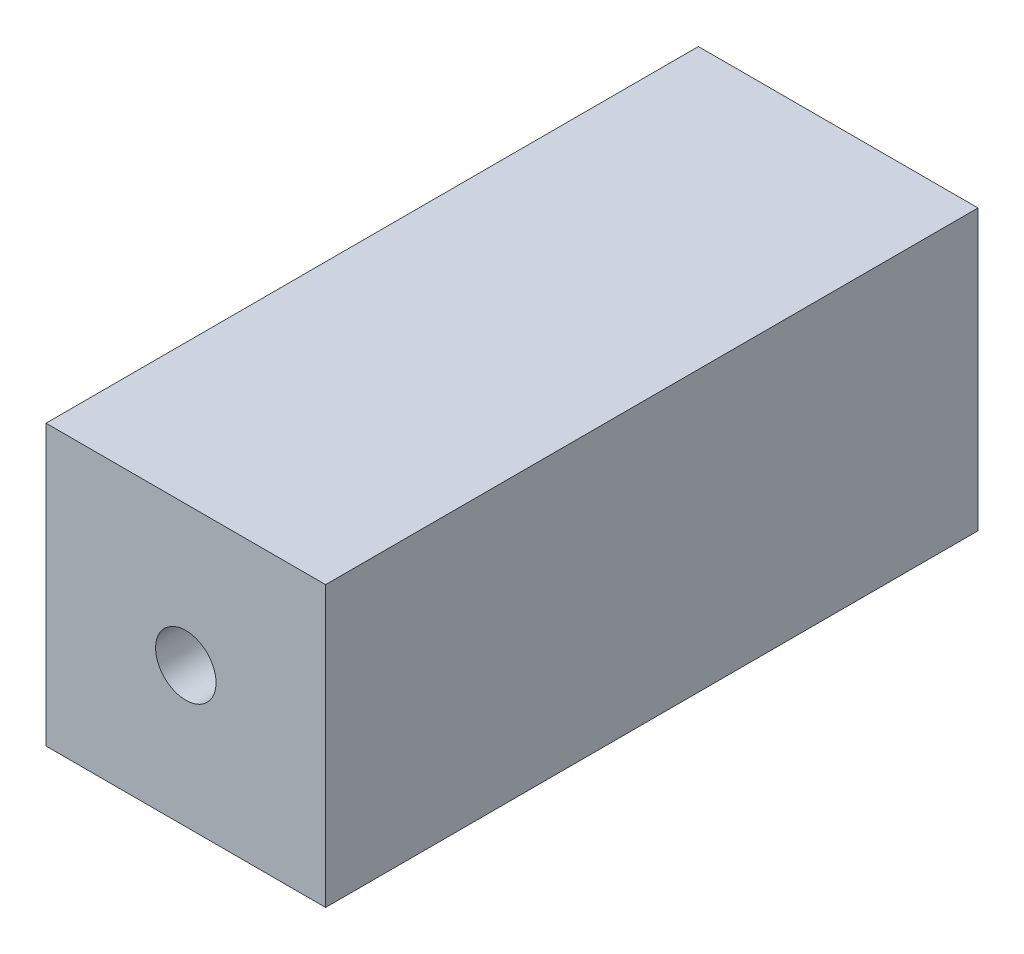
ISO-10303-21;
HEADER;
FILE_DESCRIPTION(('STEP AP214'),'2;1');
FILE_NAME('part.step','',(''),(''),'','','');
FILE_SCHEMA(('AUTOMOTIVE_DESIGN { 1 0 10303 214 1 1 1 1 }'));
ENDSEC;
DATA;
#1=APPLICATION_CONTEXT('core data for automotive mechanical design processes');
#2=APPLICATION_PROTOCOL_DEFINITION('international standard','automotive_design',2000,#1);
#3=PRODUCT_CONTEXT('',#1,'mechanical');
#4=PRODUCT('Part','Part','',(#3));
#5=PRODUCT_RELATED_PRODUCT_CATEGORY('part','',(#4));
#6=PRODUCT_DEFINITION_FORMATION('','',#4);
#7=PRODUCT_DEFINITION_CONTEXT('part definition',#1,'design');
#8=PRODUCT_DEFINITION('design','',#6,#7);
#9=PRODUCT_DEFINITION_SHAPE('','',#8);
#10=(LENGTH_UNIT() NAMED_UNIT(*) SI_UNIT(.MILLI.,.METRE.));
#11=(NAMED_UNIT(*) PLANE_ANGLE_UNIT() SI_UNIT($,.RADIAN.));
#12=(NAMED_UNIT(*) SI_UNIT($,.STERADIAN.) SOLID_ANGLE_UNIT());
#13=UNCERTAINTY_MEASURE_WITH_UNIT(LENGTH_MEASURE(1.E-05),#10,'distance_accuracy_value','');
#14=(GEOMETRIC_REPRESENTATION_CONTEXT(3) GLOBAL_UNCERTAINTY_ASSIGNED_CONTEXT((#13)) GLOBAL_UNIT_ASSIGNED_CONTEXT((#10,
#11,#12)) REPRESENTATION_CONTEXT('',''));
#15=CARTESIAN_POINT('',(0.,0.,0.));
#16=DIRECTION('',(0.,0.,1.));
#17=DIRECTION('',(1.,0.,0.));
#18=AXIS2_PLACEMENT_3D('',#15,#16,#17);
#19=CARTESIAN_POINT('',(7.5,9.99999999936563,20.));
#20=DIRECTION('',(0.,-1.,0.));
#21=DIRECTION('',(0.,0.,-1.));
#22=AXIS2_PLACEMENT_3D('',#19,#20,#21);
#23=CONICAL_SURFACE('',#22,1.22949999950379,1.02974425738303);
#24=CARTESIAN_POINT('',(7.49999999987949,10.7387581321632,20.));
#25=VERTEX_POINT('',#24);
#26=VERTEX_LOOP('',#25);
#27=FACE_BOUND('',#26,.T.);
#28=CARTESIAN_POINT('',(7.5,10.,20.));
#29=DIRECTION('',(0.,-1.,0.));
#30=DIRECTION('',(0.,0.,-1.));
#31=AXIS2_PLACEMENT_3D('',#28,#29,#30);
#32=CIRCLE('',#31,1.2295);
#33=CARTESIAN_POINT('',(7.5,10.,18.7705));
#34=VERTEX_POINT('',#33);
#35=EDGE_CURVE('E69',#34,#34,#32,.T.);
#36=ORIENTED_EDGE('',*,*,#35,.T.);
#37=EDGE_LOOP('',(#36));
#38=FACE_BOUND('',#37,.T.);
#39=ADVANCED_FACE('F17',(#27,#38),#23,.F.);
#40=CARTESIAN_POINT('',(7.5,9.99999999936563,5.));
#41=DIRECTION('',(0.,-1.,0.));
#42=DIRECTION('',(0.,0.,-1.));
#43=AXIS2_PLACEMENT_3D('',#40,#41,#42);
#44=CONICAL_SURFACE('',#43,1.22949999950379,1.02974425738303);
#45=CARTESIAN_POINT('',(7.49999999987949,10.7387581321632,5.));
#46=VERTEX_POINT('',#45);
#47=VERTEX_LOOP('',#46);
#48=FACE_BOUND('',#47,.T.);
#49=CARTESIAN_POINT('',(7.5,10.,5.));
#50=DIRECTION('',(0.,-1.,0.));
#51=DIRECTION('',(0.,0.,-1.));
#52=AXIS2_PLACEMENT_3D('',#49,#50,#51);
#53=CIRCLE('',#52,1.2295);
#54=CARTESIAN_POINT('',(7.5,10.,3.7705));
#55=VERTEX_POINT('',#54);
#56=EDGE_CURVE('E71',#55,#55,#53,.T.);
#57=ORIENTED_EDGE('',*,*,#56,.T.);
#58=EDGE_LOOP('',(#57));
#59=FACE_BOUND('',#58,.T.);
#60=ADVANCED_FACE('F66',(#48,#59),#44,.F.);
#61=CARTESIAN_POINT('',(7.5,7.5,25.0000000008299));
#62=DIRECTION('',(0.,0.,1.));
#63=DIRECTION('',(1.,0.,0.));
#64=AXIS2_PLACEMENT_3D('',#61,#62,#63);
#65=CONICAL_SURFACE('',#64,1.62099999931115,1.02974425743707);
#66=CARTESIAN_POINT('',(7.49999999993634,7.5,24.0260049351946));
#67=VERTEX_POINT('',#66);
#68=VERTEX_LOOP('',#67);
#69=FACE_BOUND('',#68,.T.);
#70=CARTESIAN_POINT('',(7.5,7.5,25.));
#71=DIRECTION('',(0.,0.,1.));
#72=DIRECTION('',(1.,0.,0.));
#73=AXIS2_PLACEMENT_3D('',#70,#71,#72);
#74=CIRCLE('',#73,1.621);
#75=CARTESIAN_POINT('',(9.121,7.5,25.));
#76=VERTEX_POINT('',#75);
#77=EDGE_CURVE('E74',#76,#76,#74,.T.);
#78=ORIENTED_EDGE('',*,*,#77,.T.);
#79=EDGE_LOOP('',(#78));
#80=FACE_BOUND('',#79,.T.);
#81=ADVANCED_FACE('F220',(#69,#80),#65,.F.);
#82=CARTESIAN_POINT('',(7.5,5.,20.));
#83=DIRECTION('',(0.,-1.,0.));
#84=DIRECTION('',(0.,0.,-1.));
#85=AXIS2_PLACEMENT_3D('',#82,#83,#84);
#86=CYLINDRICAL_SURFACE('',#85,1.2295);
#87=ORIENTED_EDGE('',*,*,#35,.F.);
#88=EDGE_LOOP('',(#87));
#89=FACE_BOUND('',#88,.T.);
#90=CARTESIAN_POINT('',(7.5,0.,20.));
#91=DIRECTION('',(0.,-1.,0.));
#92=DIRECTION('',(0.,0.,-1.));
#93=AXIS2_PLACEMENT_3D('',#90,#91,#92);
#94=CIRCLE('',#93,1.2295);
#95=CARTESIAN_POINT('',(7.5,0.,18.7705));
#96=VERTEX_POINT('',#95);
#97=EDGE_CURVE('E20',#96,#96,#94,.F.);
#98=ORIENTED_EDGE('',*,*,#97,.F.);
#99=EDGE_LOOP('',(#98));
#100=FACE_BOUND('',#99,.T.);
#101=ADVANCED_FACE('F211',(#89,#100),#86,.F.);
#102=CARTESIAN_POINT('',(7.5,5.,5.));
#103=DIRECTION('',(0.,-1.,0.));
#104=DIRECTION('',(0.,0.,-1.));
#105=AXIS2_PLACEMENT_3D('',#102,#103,#104);
#106=CYLINDRICAL_SURFACE('',#105,1.2295);
#107=ORIENTED_EDGE('',*,*,#56,.F.);
#108=EDGE_LOOP('',(#107));
#109=FACE_BOUND('',#108,.T.);
#110=CARTESIAN_POINT('',(7.5,0.,5.));
#111=DIRECTION('',(0.,-1.,0.));
#112=DIRECTION('',(0.,0.,-1.));
#113=AXIS2_PLACEMENT_3D('',#110,#111,#112);
#114=CIRCLE('',#113,1.2295);
#115=CARTESIAN_POINT('',(7.5,0.,3.7705));
#116=VERTEX_POINT('',#115);
#117=EDGE_CURVE('E85',#116,#116,#114,.F.);
#118=ORIENTED_EDGE('',*,*,#117,.F.);
#119=EDGE_LOOP('',(#118));
#120=FACE_BOUND('',#119,.T.);
#121=ADVANCED_FACE('F202',(#109,#120),#106,.F.);
#122=CARTESIAN_POINT('',(7.5,7.5,30.));
#123=DIRECTION('',(0.,0.,1.));
#124=DIRECTION('',(1.,0.,0.));
#125=AXIS2_PLACEMENT_3D('',#122,#123,#124);
#126=CYLINDRICAL_SURFACE('',#125,1.621);
#127=ORIENTED_EDGE('',*,*,#77,.F.);
#128=EDGE_LOOP('',(#127));
#129=FACE_BOUND('',#128,.T.);
#130=CARTESIAN_POINT('',(7.5,7.5,35.));
#131=DIRECTION('',(0.,0.,1.));
#132=DIRECTION('',(1.,0.,0.));
#133=AXIS2_PLACEMENT_3D('',#130,#131,#132);
#134=CIRCLE('',#133,1.621);
#135=CARTESIAN_POINT('',(9.121,7.5,35.));
#136=VERTEX_POINT('',#135);
#137=EDGE_CURVE('E81',#136,#136,#134,.F.);
#138=ORIENTED_EDGE('',*,*,#137,.F.);
#139=EDGE_LOOP('',(#138));
#140=FACE_BOUND('',#139,.T.);
#141=ADVANCED_FACE('F148',(#129,#140),#126,.F.);
#142=CARTESIAN_POINT('',(15.,0.,0.));
#143=DIRECTION('',(0.,-1.,0.));
#144=DIRECTION('',(0.,0.,-1.));
#145=AXIS2_PLACEMENT_3D('',#142,#143,#144);
#146=PLANE('',#145);
#147=ORIENTED_EDGE('',*,*,#117,.T.);
#148=EDGE_LOOP('',(#147));
#149=FACE_BOUND('',#148,.T.);
#150=ORIENTED_EDGE('',*,*,#97,.T.);
#151=EDGE_LOOP('',(#150));
#152=FACE_BOUND('',#151,.T.);
#153=DIRECTION('',(1.,0.,0.));
#154=VECTOR('',#153,1.);
#155=CARTESIAN_POINT('',(7.5,0.,0.));
#156=LINE('',#155,#154);
#157=CARTESIAN_POINT('',(0.,0.,0.));
#158=VERTEX_POINT('',#157);
#159=CARTESIAN_POINT('',(15.,0.,0.));
#160=VERTEX_POINT('',#159);
#161=EDGE_CURVE('E106',#158,#160,#156,.T.);
#162=ORIENTED_EDGE('',*,*,#161,.T.);
#163=DIRECTION('',(0.,0.,-1.));
#164=VECTOR('',#163,1.);
#165=CARTESIAN_POINT('',(15.,0.,0.));
#166=LINE('',#165,#164);
#167=CARTESIAN_POINT('',(15.,0.,35.));
#168=VERTEX_POINT('',#167);
#169=EDGE_CURVE('E102',#168,#160,#166,.T.);
#170=ORIENTED_EDGE('',*,*,#169,.F.);
#171=DIRECTION('',(1.,0.,0.));
#172=VECTOR('',#171,1.);
#173=CARTESIAN_POINT('',(7.5,0.,35.));
#174=LINE('',#173,#172);
#175=CARTESIAN_POINT('',(0.,0.,35.));
#176=VERTEX_POINT('',#175);
#177=EDGE_CURVE('E84',#176,#168,#174,.T.);
#178=ORIENTED_EDGE('',*,*,#177,.F.);
#179=DIRECTION('',(0.,0.,1.));
#180=VECTOR('',#179,1.);
#181=CARTESIAN_POINT('',(0.,0.,0.));
#182=LINE('',#181,#180);
#183=EDGE_CURVE('E113',#158,#176,#182,.T.);
#184=ORIENTED_EDGE('',*,*,#183,.F.);
#185=EDGE_LOOP('',(#162,#170,#178,#184));
#186=FACE_BOUND('',#185,.T.);
#187=ADVANCED_FACE('F133',(#149,#152,#186),#146,.T.);
#188=CARTESIAN_POINT('',(7.5,7.5,35.));
#189=DIRECTION('',(0.,0.,1.));
#190=DIRECTION('',(1.,0.,0.));
#191=AXIS2_PLACEMENT_3D('',#188,#189,#190);
#192=PLANE('',#191);
#193=ORIENTED_EDGE('',*,*,#137,.T.);
#194=EDGE_LOOP('',(#193));
#195=FACE_BOUND('',#194,.T.);
#196=DIRECTION('',(0.,1.,0.));
#197=VECTOR('',#196,1.);
#198=CARTESIAN_POINT('',(15.,15.,35.));
#199=LINE('',#198,#197);
#200=CARTESIAN_POINT('',(15.,15.,35.));
#201=VERTEX_POINT('',#200);
#202=EDGE_CURVE('E83',#201,#168,#199,.F.);
#203=ORIENTED_EDGE('',*,*,#202,.F.);
#204=DIRECTION('',(1.,0.,0.));
#205=VECTOR('',#204,1.);
#206=CARTESIAN_POINT('',(0.,15.,35.));
#207=LINE('',#206,#205);
#208=CARTESIAN_POINT('',(0.,15.,35.));
#209=VERTEX_POINT('',#208);
#210=EDGE_CURVE('E116',#209,#201,#207,.T.);
#211=ORIENTED_EDGE('',*,*,#210,.F.);
#212=DIRECTION('',(0.,1.,0.));
#213=VECTOR('',#212,1.);
#214=CARTESIAN_POINT('',(0.,0.,35.));
#215=LINE('',#214,#213);
#216=EDGE_CURVE('E109',#176,#209,#215,.T.);
#217=ORIENTED_EDGE('',*,*,#216,.F.);
#218=ORIENTED_EDGE('',*,*,#177,.T.);
#219=EDGE_LOOP('',(#203,#211,#217,#218));
#220=FACE_BOUND('',#219,.T.);
#221=ADVANCED_FACE('F138',(#195,#220),#192,.T.);
#222=CARTESIAN_POINT('',(15.,15.,0.));
#223=DIRECTION('',(1.,0.,0.));
#224=DIRECTION('',(0.,0.,-1.));
#225=AXIS2_PLACEMENT_3D('',#222,#223,#224);
#226=PLANE('',#225);
#227=DIRECTION('',(0.,1.,0.));
#228=VECTOR('',#227,1.);
#229=CARTESIAN_POINT('',(15.,7.5,0.));
#230=LINE('',#229,#228);
#231=CARTESIAN_POINT('',(15.,15.,0.));
#232=VERTEX_POINT('',#231);
#233=EDGE_CURVE('E104',#160,#232,#230,.T.);
#234=ORIENTED_EDGE('',*,*,#233,.T.);
#235=DIRECTION('',(0.,0.,1.));
#236=VECTOR('',#235,1.);
#237=CARTESIAN_POINT('',(15.,15.,0.));
#238=LINE('',#237,#236);
#239=EDGE_CURVE('E119',#201,#232,#238,.F.);
#240=ORIENTED_EDGE('',*,*,#239,.F.);
#241=ORIENTED_EDGE('',*,*,#202,.T.);
#242=ORIENTED_EDGE('',*,*,#169,.T.);
#243=EDGE_LOOP('',(#234,#240,#241,#242));
#244=FACE_BOUND('',#243,.T.);
#245=ADVANCED_FACE('F130',(#244),#226,.T.);
#246=CARTESIAN_POINT('',(7.5,7.5,0.));
#247=DIRECTION('',(0.,0.,1.));
#248=DIRECTION('',(1.,0.,0.));
#249=AXIS2_PLACEMENT_3D('',#246,#247,#248);
#250=PLANE('',#249);
#251=DIRECTION('',(0.,1.,0.));
#252=VECTOR('',#251,1.);
#253=CARTESIAN_POINT('',(0.,0.,0.));
#254=LINE('',#253,#252);
#255=CARTESIAN_POINT('',(0.,15.,0.));
#256=VERTEX_POINT('',#255);
#257=EDGE_CURVE('E35',#256,#158,#254,.F.);
#258=ORIENTED_EDGE('',*,*,#257,.F.);
#259=DIRECTION('',(1.,0.,0.));
#260=VECTOR('',#259,1.);
#261=CARTESIAN_POINT('',(0.,15.,0.));
#262=LINE('',#261,#260);
#263=EDGE_CURVE('E26',#232,#256,#262,.F.);
#264=ORIENTED_EDGE('',*,*,#263,.F.);
#265=ORIENTED_EDGE('',*,*,#233,.F.);
#266=ORIENTED_EDGE('',*,*,#161,.F.);
#267=EDGE_LOOP('',(#258,#264,#265,#266));
#268=FACE_BOUND('',#267,.T.);
#269=ADVANCED_FACE('F127',(#268),#250,.F.);
#270=CARTESIAN_POINT('',(0.,0.,0.));
#271=DIRECTION('',(-1.,0.,0.));
#272=DIRECTION('',(0.,0.,1.));
#273=AXIS2_PLACEMENT_3D('',#270,#271,#272);
#274=PLANE('',#273);
#275=ORIENTED_EDGE('',*,*,#257,.T.);
#276=ORIENTED_EDGE('',*,*,#183,.T.);
#277=ORIENTED_EDGE('',*,*,#216,.T.);
#278=DIRECTION('',(0.,0.,1.));
#279=VECTOR('',#278,1.);
#280=CARTESIAN_POINT('',(0.,15.,0.));
#281=LINE('',#280,#279);
#282=EDGE_CURVE('E11',#256,#209,#281,.T.);
#283=ORIENTED_EDGE('',*,*,#282,.F.);
#284=EDGE_LOOP('',(#275,#276,#277,#283));
#285=FACE_BOUND('',#284,.T.);
#286=ADVANCED_FACE('F136',(#285),#274,.T.);
#287=CARTESIAN_POINT('',(0.,15.,0.));
#288=DIRECTION('',(0.,1.,0.));
#289=DIRECTION('',(0.,0.,1.));
#290=AXIS2_PLACEMENT_3D('',#287,#288,#289);
#291=PLANE('',#290);
#292=ORIENTED_EDGE('',*,*,#263,.T.);
#293=ORIENTED_EDGE('',*,*,#282,.T.);
#294=ORIENTED_EDGE('',*,*,#210,.T.);
#295=ORIENTED_EDGE('',*,*,#239,.T.);
#296=EDGE_LOOP('',(#292,#293,#294,#295));
#297=FACE_BOUND('',#296,.T.);
#298=ADVANCED_FACE('F124',(#297),#291,.T.);
#299=CLOSED_SHELL('',(#39,#60,#81,#101,#121,#141,#187,#221,#245,#269,#286,#298));
#300=MANIFOLD_SOLID_BREP('B1',#299);
#301=ADVANCED_BREP_SHAPE_REPRESENTATION('',(#18,#300),#14);
#302=SHAPE_DEFINITION_REPRESENTATION(#9,#301);
ENDSEC;
END-ISO-10303-21;
